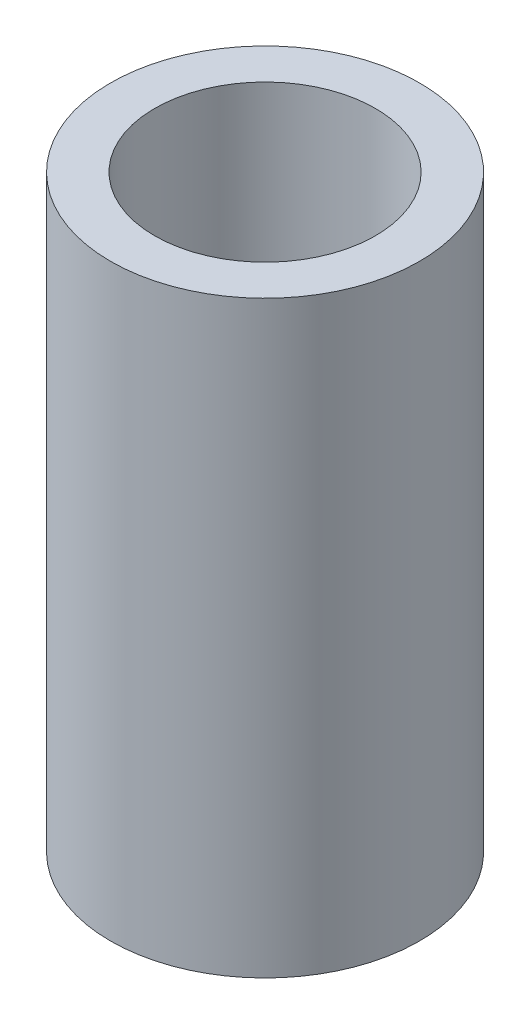
ISO-10303-21;
HEADER;
FILE_DESCRIPTION(('STEP AP214'),'2;1');
FILE_NAME('part.step','',(''),(''),'','','');
FILE_SCHEMA(('AUTOMOTIVE_DESIGN { 1 0 10303 214 1 1 1 1 }'));
ENDSEC;
DATA;
#1=APPLICATION_CONTEXT('core data for automotive mechanical design processes');
#2=APPLICATION_PROTOCOL_DEFINITION('international standard','automotive_design',2000,#1);
#3=PRODUCT_CONTEXT('',#1,'mechanical');
#4=PRODUCT('Part','Part','',(#3));
#5=PRODUCT_RELATED_PRODUCT_CATEGORY('part','',(#4));
#6=PRODUCT_DEFINITION_FORMATION('','',#4);
#7=PRODUCT_DEFINITION_CONTEXT('part definition',#1,'design');
#8=PRODUCT_DEFINITION('design','',#6,#7);
#9=PRODUCT_DEFINITION_SHAPE('','',#8);
#10=(LENGTH_UNIT() NAMED_UNIT(*) SI_UNIT(.MILLI.,.METRE.));
#11=(NAMED_UNIT(*) PLANE_ANGLE_UNIT() SI_UNIT($,.RADIAN.));
#12=(NAMED_UNIT(*) SI_UNIT($,.STERADIAN.) SOLID_ANGLE_UNIT());
#13=UNCERTAINTY_MEASURE_WITH_UNIT(LENGTH_MEASURE(1.E-05),#10,'distance_accuracy_value','');
#14=(GEOMETRIC_REPRESENTATION_CONTEXT(3) GLOBAL_UNCERTAINTY_ASSIGNED_CONTEXT((#13)) GLOBAL_UNIT_ASSIGNED_CONTEXT((#10,
#11,#12)) REPRESENTATION_CONTEXT('',''));
#15=CARTESIAN_POINT('',(0.,0.,0.));
#16=DIRECTION('',(0.,0.,1.));
#17=DIRECTION('',(1.,0.,0.));
#18=AXIS2_PLACEMENT_3D('',#15,#16,#17);
#19=CARTESIAN_POINT('',(0.,4.,0.));
#20=DIRECTION('',(0.,1.,0.));
#21=DIRECTION('',(0.,0.,1.));
#22=AXIS2_PLACEMENT_3D('',#19,#20,#21);
#23=PLANE('',#22);
#24=CARTESIAN_POINT('',(0.,4.,0.));
#25=DIRECTION('',(0.,1.,0.));
#26=DIRECTION('',(0.,0.,1.));
#27=AXIS2_PLACEMENT_3D('',#24,#25,#26);
#28=CIRCLE('',#27,2.1);
#29=CARTESIAN_POINT('',(0.,4.,2.1));
#30=VERTEX_POINT('',#29);
#31=EDGE_CURVE('E10',#30,#30,#28,.T.);
#32=ORIENTED_EDGE('',*,*,#31,.T.);
#33=EDGE_LOOP('',(#32));
#34=FACE_BOUND('',#33,.T.);
#35=CARTESIAN_POINT('',(0.,4.,0.));
#36=DIRECTION('',(0.,1.,0.));
#37=DIRECTION('',(0.,0.,1.));
#38=AXIS2_PLACEMENT_3D('',#35,#36,#37);
#39=CIRCLE('',#38,1.5);
#40=CARTESIAN_POINT('',(0.,4.,1.5));
#41=VERTEX_POINT('',#40);
#42=EDGE_CURVE('E56',#41,#41,#39,.T.);
#43=ORIENTED_EDGE('',*,*,#42,.F.);
#44=EDGE_LOOP('',(#43));
#45=FACE_BOUND('',#44,.T.);
#46=ADVANCED_FACE('F43',(#34,#45),#23,.T.);
#47=CARTESIAN_POINT('',(0.,-4.,0.));
#48=DIRECTION('',(0.,1.,0.));
#49=DIRECTION('',(0.,0.,1.));
#50=AXIS2_PLACEMENT_3D('',#47,#48,#49);
#51=PLANE('',#50);
#52=CARTESIAN_POINT('',(0.,-4.,0.));
#53=DIRECTION('',(0.,1.,0.));
#54=DIRECTION('',(0.,0.,1.));
#55=AXIS2_PLACEMENT_3D('',#52,#53,#54);
#56=CIRCLE('',#55,2.1);
#57=CARTESIAN_POINT('',(0.,-4.,2.1));
#58=VERTEX_POINT('',#57);
#59=EDGE_CURVE('E47',#58,#58,#56,.T.);
#60=ORIENTED_EDGE('',*,*,#59,.F.);
#61=EDGE_LOOP('',(#60));
#62=FACE_BOUND('',#61,.T.);
#63=CARTESIAN_POINT('',(0.,-4.,0.));
#64=DIRECTION('',(0.,1.,0.));
#65=DIRECTION('',(0.,0.,1.));
#66=AXIS2_PLACEMENT_3D('',#63,#64,#65);
#67=CIRCLE('',#66,1.5);
#68=CARTESIAN_POINT('',(0.,-4.,1.5));
#69=VERTEX_POINT('',#68);
#70=EDGE_CURVE('E58',#69,#69,#67,.T.);
#71=ORIENTED_EDGE('',*,*,#70,.T.);
#72=EDGE_LOOP('',(#71));
#73=FACE_BOUND('',#72,.T.);
#74=ADVANCED_FACE('F70',(#62,#73),#51,.F.);
#75=CARTESIAN_POINT('',(0.,4.,0.));
#76=DIRECTION('',(0.,-1.,0.));
#77=DIRECTION('',(0.,0.,-1.));
#78=AXIS2_PLACEMENT_3D('',#75,#76,#77);
#79=CYLINDRICAL_SURFACE('',#78,2.1);
#80=ORIENTED_EDGE('',*,*,#31,.F.);
#81=EDGE_LOOP('',(#80));
#82=FACE_BOUND('',#81,.T.);
#83=ORIENTED_EDGE('',*,*,#59,.T.);
#84=EDGE_LOOP('',(#83));
#85=FACE_BOUND('',#84,.T.);
#86=ADVANCED_FACE('F45',(#82,#85),#79,.T.);
#87=CARTESIAN_POINT('',(0.,4.,0.));
#88=DIRECTION('',(0.,-1.,0.));
#89=DIRECTION('',(0.,0.,-1.));
#90=AXIS2_PLACEMENT_3D('',#87,#88,#89);
#91=CYLINDRICAL_SURFACE('',#90,1.5);
#92=ORIENTED_EDGE('',*,*,#42,.T.);
#93=EDGE_LOOP('',(#92));
#94=FACE_BOUND('',#93,.T.);
#95=ORIENTED_EDGE('',*,*,#70,.F.);
#96=EDGE_LOOP('',(#95));
#97=FACE_BOUND('',#96,.T.);
#98=ADVANCED_FACE('F66',(#94,#97),#91,.F.);
#99=CLOSED_SHELL('',(#46,#74,#86,#98));
#100=MANIFOLD_SOLID_BREP('B2',#99);
#101=ADVANCED_BREP_SHAPE_REPRESENTATION('',(#18,#100),#14);
#102=SHAPE_DEFINITION_REPRESENTATION(#9,#101);
ENDSEC;
END-ISO-10303-21;
